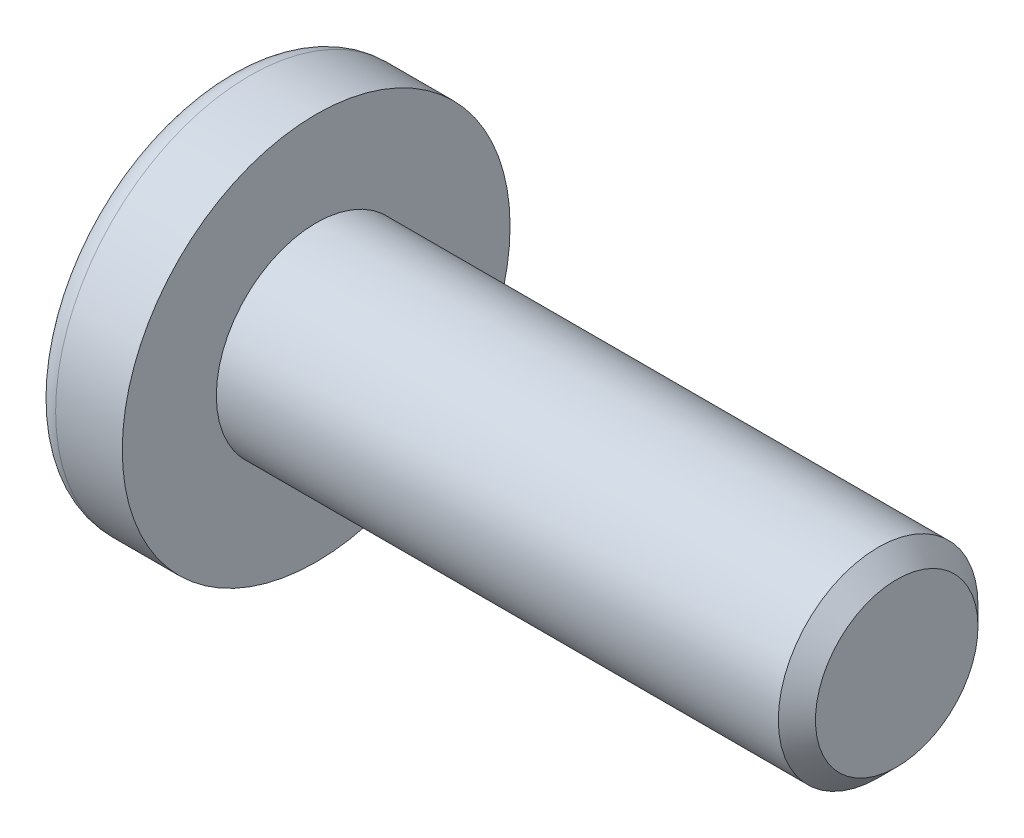
ISO-10303-21;
HEADER;
FILE_DESCRIPTION(('STEP AP214'),'2;1');
FILE_NAME('part.step','',(''),(''),'','','');
FILE_SCHEMA(('AUTOMOTIVE_DESIGN { 1 0 10303 214 1 1 1 1 }'));
ENDSEC;
DATA;
#1=APPLICATION_CONTEXT('core data for automotive mechanical design processes');
#2=APPLICATION_PROTOCOL_DEFINITION('international standard','automotive_design',2000,#1);
#3=PRODUCT_CONTEXT('',#1,'mechanical');
#4=PRODUCT('Part','Part','',(#3));
#5=PRODUCT_RELATED_PRODUCT_CATEGORY('part','',(#4));
#6=PRODUCT_DEFINITION_FORMATION('','',#4);
#7=PRODUCT_DEFINITION_CONTEXT('part definition',#1,'design');
#8=PRODUCT_DEFINITION('design','',#6,#7);
#9=PRODUCT_DEFINITION_SHAPE('','',#8);
#10=(LENGTH_UNIT() NAMED_UNIT(*) SI_UNIT(.MILLI.,.METRE.));
#11=(NAMED_UNIT(*) PLANE_ANGLE_UNIT() SI_UNIT($,.RADIAN.));
#12=(NAMED_UNIT(*) SI_UNIT($,.STERADIAN.) SOLID_ANGLE_UNIT());
#13=UNCERTAINTY_MEASURE_WITH_UNIT(LENGTH_MEASURE(1.E-05),#10,'distance_accuracy_value','');
#14=(GEOMETRIC_REPRESENTATION_CONTEXT(3) GLOBAL_UNCERTAINTY_ASSIGNED_CONTEXT((#13)) GLOBAL_UNIT_ASSIGNED_CONTEXT((#10,
#11,#12)) REPRESENTATION_CONTEXT('',''));
#15=CARTESIAN_POINT('',(0.,0.,0.));
#16=DIRECTION('',(0.,0.,1.));
#17=DIRECTION('',(1.,0.,0.));
#18=AXIS2_PLACEMENT_3D('',#15,#16,#17);
#19=CARTESIAN_POINT('',(3.49504,0.,0.));
#20=DIRECTION('',(-1.,0.,0.));
#21=DIRECTION('',(0.,1.,0.));
#22=AXIS2_PLACEMENT_3D('',#19,#20,#21);
#23=SPHERICAL_SURFACE('',#22,3.49504);
#24=CARTESIAN_POINT('',(0.638066947960321,0.,0.));
#25=DIRECTION('',(-1.,0.,0.));
#26=DIRECTION('',(0.,0.,1.));
#27=AXIS2_PLACEMENT_3D('',#24,#25,#26);
#28=CIRCLE('',#27,2.01320877742947);
#29=CARTESIAN_POINT('',(0.638066947960321,0.,2.01320877742947));
#30=VERTEX_POINT('',#29);
#31=EDGE_CURVE('E137',#30,#30,#28,.T.);
#32=ORIENTED_EDGE('',*,*,#31,.T.);
#33=EDGE_LOOP('',(#32));
#34=FACE_BOUND('',#33,.T.);
#35=CARTESIAN_POINT('',(3.48860800425343,-0.0562204072662827,0.));
#36=DIRECTION('',(-0.113665320353011,-0.99351909641891,0.));
#37=DIRECTION('',(0.99351909641891,-0.113665320353011,0.));
#38=AXIS2_PLACEMENT_3D('',#35,#36,#37);
#39=CIRCLE('',#38,3.49458187725478);
#40=CARTESIAN_POINT('',(0.227775025036725,0.316840992898337,1.19995665346604));
#41=VERTEX_POINT('',#40);
#42=CARTESIAN_POINT('',(0.033060362162214,0.339117670430593,0.339117670430593));
#43=VERTEX_POINT('',#42);
#44=EDGE_CURVE('E133',#41,#43,#39,.T.);
#45=ORIENTED_EDGE('',*,*,#44,.F.);
#46=CARTESIAN_POINT('',(2.78874832810788,0.,-0.872695468934767));
#47=DIRECTION('',(0.629103472698606,0.,0.777321568360582));
#48=DIRECTION('',(0.777321568360582,0.,-0.629103472698606));
#49=AXIS2_PLACEMENT_3D('',#46,#47,#48);
#50=CIRCLE('',#49,3.30981257691679);
#51=CARTESIAN_POINT('',(0.227775025036724,-0.316840992898345,1.19995665346604));
#52=VERTEX_POINT('',#51);
#53=EDGE_CURVE('E125',#41,#52,#50,.T.);
#54=ORIENTED_EDGE('',*,*,#53,.T.);
#55=CARTESIAN_POINT('',(3.48860800425343,0.0562204072662818,0.));
#56=DIRECTION('',(-0.11366532035301,0.99351909641891,0.));
#57=DIRECTION('',(-0.99351909641891,-0.11366532035301,0.));
#58=AXIS2_PLACEMENT_3D('',#55,#56,#57);
#59=CIRCLE('',#58,3.49458187725478);
#60=CARTESIAN_POINT('',(0.0330603621622127,-0.339117670430595,0.339117670430594));
#61=VERTEX_POINT('',#60);
#62=EDGE_CURVE('E376',#61,#52,#59,.T.);
#63=ORIENTED_EDGE('',*,*,#62,.F.);
#64=CARTESIAN_POINT('',(3.48860800425343,0.,-0.0562204072662819));
#65=DIRECTION('',(-0.11366532035301,0.,-0.99351909641891));
#66=DIRECTION('',(-0.99351909641891,0.,0.11366532035301));
#67=AXIS2_PLACEMENT_3D('',#64,#65,#66);
#68=CIRCLE('',#67,3.49458187725478);
#69=CARTESIAN_POINT('',(0.227775025036724,-1.19995665346604,0.316840992898341));
#70=VERTEX_POINT('',#69);
#71=EDGE_CURVE('E171',#70,#61,#68,.T.);
#72=ORIENTED_EDGE('',*,*,#71,.F.);
#73=CARTESIAN_POINT('',(2.78874832810788,0.872695468934764,0.));
#74=DIRECTION('',(0.629103472698606,-0.777321568360582,0.));
#75=DIRECTION('',(0.777321568360582,0.629103472698606,0.));
#76=AXIS2_PLACEMENT_3D('',#73,#74,#75);
#77=CIRCLE('',#76,3.30981257691679);
#78=CARTESIAN_POINT('',(0.227775025036722,-1.19995665346604,-0.316840992898341));
#79=VERTEX_POINT('',#78);
#80=EDGE_CURVE('E167',#70,#79,#77,.T.);
#81=ORIENTED_EDGE('',*,*,#80,.T.);
#82=CARTESIAN_POINT('',(3.48860800425343,0.,0.0562204072662826));
#83=DIRECTION('',(-0.113665320353011,0.,0.99351909641891));
#84=DIRECTION('',(0.99351909641891,0.,0.113665320353011));
#85=AXIS2_PLACEMENT_3D('',#82,#83,#84);
#86=CIRCLE('',#85,3.49458187725478);
#87=CARTESIAN_POINT('',(0.0330603621622127,-0.339117670430592,-0.339117670430594));
#88=VERTEX_POINT('',#87);
#89=EDGE_CURVE('E51',#88,#79,#86,.T.);
#90=ORIENTED_EDGE('',*,*,#89,.F.);
#91=CARTESIAN_POINT('',(0.227775025036724,-0.316840992898336,-1.19995665346604));
#92=VERTEX_POINT('',#91);
#93=EDGE_CURVE('E374',#92,#88,#59,.T.);
#94=ORIENTED_EDGE('',*,*,#93,.F.);
#95=CARTESIAN_POINT('',(2.78874832810788,0.,0.872695468934766));
#96=DIRECTION('',(0.629103472698606,0.,-0.777321568360582));
#97=DIRECTION('',(-0.777321568360582,0.,-0.629103472698606));
#98=AXIS2_PLACEMENT_3D('',#95,#96,#97);
#99=CIRCLE('',#98,3.30981257691679);
#100=CARTESIAN_POINT('',(0.227775025036724,0.316840992898345,-1.19995665346604));
#101=VERTEX_POINT('',#100);
#102=EDGE_CURVE('E381',#92,#101,#99,.T.);
#103=ORIENTED_EDGE('',*,*,#102,.T.);
#104=CARTESIAN_POINT('',(0.033060362162214,0.339117670430595,-0.339117670430594));
#105=VERTEX_POINT('',#104);
#106=EDGE_CURVE('E110',#105,#101,#39,.T.);
#107=ORIENTED_EDGE('',*,*,#106,.F.);
#108=CARTESIAN_POINT('',(0.227775025036726,1.19995665346604,-0.316840992898341));
#109=VERTEX_POINT('',#108);
#110=EDGE_CURVE('E132',#109,#105,#86,.T.);
#111=ORIENTED_EDGE('',*,*,#110,.F.);
#112=CARTESIAN_POINT('',(2.78874832810788,-0.872695468934769,0.));
#113=DIRECTION('',(0.629103472698606,0.777321568360582,0.));
#114=DIRECTION('',(-0.777321568360582,0.629103472698606,0.));
#115=AXIS2_PLACEMENT_3D('',#112,#113,#114);
#116=CIRCLE('',#115,3.30981257691679);
#117=CARTESIAN_POINT('',(0.227775025036726,1.19995665346604,0.31684099289834));
#118=VERTEX_POINT('',#117);
#119=EDGE_CURVE('E59',#109,#118,#116,.T.);
#120=ORIENTED_EDGE('',*,*,#119,.T.);
#121=EDGE_CURVE('E170',#43,#118,#68,.T.);
#122=ORIENTED_EDGE('',*,*,#121,.F.);
#123=EDGE_LOOP('',(#45,#54,#63,#72,#81,#90,#94,#103,#107,#111,#120,#122));
#124=FACE_BOUND('',#123,.T.);
#125=ADVANCED_FACE('F36',(#34,#124),#23,.T.);
#126=CARTESIAN_POINT('',(1.71044397905759,0.,-0.147213612565445));
#127=DIRECTION('',(-0.113665320353011,0.,0.99351909641891));
#128=DIRECTION('',(0.99351909641891,0.,0.113665320353011));
#129=AXIS2_PLACEMENT_3D('',#126,#127,#128);
#130=PLANE('',#129);
#131=ORIENTED_EDGE('',*,*,#110,.T.);
#132=DIRECTION('',(0.987162587649563,-0.112938092654823,0.112938092654823));
#133=VECTOR('',#132,1.);
#134=CARTESIAN_POINT('',(1.72685656853982,0.145335901056886,-0.145335901056885));
#135=LINE('',#134,#133);
#136=CARTESIAN_POINT('',(1.4986,0.171450000000001,-0.17145));
#137=VERTEX_POINT('',#136);
#138=EDGE_CURVE('E108',#105,#137,#135,.T.);
#139=ORIENTED_EDGE('',*,*,#138,.T.);
#140=DIRECTION('',(0.774265880811046,-0.626630437436058,0.0885812660249925));
#141=VECTOR('',#140,1.);
#142=CARTESIAN_POINT('',(0.,1.3843,-0.3429));
#143=LINE('',#142,#141);
#144=EDGE_CURVE('E130',#109,#137,#143,.T.);
#145=ORIENTED_EDGE('',*,*,#144,.F.);
#146=EDGE_LOOP('',(#131,#139,#145));
#147=FACE_BOUND('',#146,.T.);
#148=ADVANCED_FACE('F129',(#147),#130,.T.);
#149=DIRECTION('',(0.774265880811046,0.626630437436058,0.0885812660249925));
#150=VECTOR('',#149,1.);
#151=CARTESIAN_POINT('',(0.,-1.3843,-0.3429));
#152=LINE('',#151,#150);
#153=CARTESIAN_POINT('',(1.4986,-0.17145,-0.17145));
#154=VERTEX_POINT('',#153);
#155=EDGE_CURVE('E152',#79,#154,#152,.T.);
#156=ORIENTED_EDGE('',*,*,#155,.T.);
#157=DIRECTION('',(-0.987162587649563,-0.112938092654822,-0.112938092654823));
#158=VECTOR('',#157,1.);
#159=CARTESIAN_POINT('',(1.72685656853982,-0.145335901056885,-0.145335901056885));
#160=LINE('',#159,#158);
#161=EDGE_CURVE('E365',#154,#88,#160,.T.);
#162=ORIENTED_EDGE('',*,*,#161,.T.);
#163=ORIENTED_EDGE('',*,*,#89,.T.);
#164=EDGE_LOOP('',(#156,#162,#163));
#165=FACE_BOUND('',#164,.T.);
#166=ADVANCED_FACE('F200',(#165),#130,.T.);
#167=CARTESIAN_POINT('',(1.71044397905759,0.,0.147213612565445));
#168=DIRECTION('',(-0.11366532035301,0.,-0.99351909641891));
#169=DIRECTION('',(-0.99351909641891,0.,0.11366532035301));
#170=AXIS2_PLACEMENT_3D('',#167,#168,#169);
#171=PLANE('',#170);
#172=DIRECTION('',(0.774265880811046,-0.626630437436058,-0.0885812660249922));
#173=VECTOR('',#172,1.);
#174=CARTESIAN_POINT('',(0.,1.3843,0.342899999999999));
#175=LINE('',#174,#173);
#176=CARTESIAN_POINT('',(1.4986,0.17145,0.17145));
#177=VERTEX_POINT('',#176);
#178=EDGE_CURVE('E138',#118,#177,#175,.T.);
#179=ORIENTED_EDGE('',*,*,#178,.T.);
#180=DIRECTION('',(-0.987162587649563,0.112938092654822,0.112938092654822));
#181=VECTOR('',#180,1.);
#182=CARTESIAN_POINT('',(1.72685656853981,0.145335901056885,0.145335901056886));
#183=LINE('',#182,#181);
#184=EDGE_CURVE('E371',#177,#43,#183,.T.);
#185=ORIENTED_EDGE('',*,*,#184,.T.);
#186=ORIENTED_EDGE('',*,*,#121,.T.);
#187=EDGE_LOOP('',(#179,#185,#186));
#188=FACE_BOUND('',#187,.T.);
#189=ADVANCED_FACE('F231',(#188),#171,.T.);
#190=ORIENTED_EDGE('',*,*,#71,.T.);
#191=DIRECTION('',(0.987162587649563,0.112938092654823,-0.112938092654822));
#192=VECTOR('',#191,1.);
#193=CARTESIAN_POINT('',(1.72685656853982,-0.145335901056886,0.145335901056886));
#194=LINE('',#193,#192);
#195=CARTESIAN_POINT('',(1.4986,-0.171450000000001,0.171449999999999));
#196=VERTEX_POINT('',#195);
#197=EDGE_CURVE('E378',#61,#196,#194,.T.);
#198=ORIENTED_EDGE('',*,*,#197,.T.);
#199=DIRECTION('',(0.774265880811046,0.626630437436058,-0.0885812660249922));
#200=VECTOR('',#199,1.);
#201=CARTESIAN_POINT('',(0.,-1.3843,0.342899999999999));
#202=LINE('',#201,#200);
#203=EDGE_CURVE('E149',#70,#196,#202,.T.);
#204=ORIENTED_EDGE('',*,*,#203,.F.);
#205=EDGE_LOOP('',(#190,#198,#204));
#206=FACE_BOUND('',#205,.T.);
#207=ADVANCED_FACE('F220',(#206),#171,.T.);
#208=CARTESIAN_POINT('',(-25.4,0.,0.));
#209=DIRECTION('',(-1.,0.,0.));
#210=DIRECTION('',(0.,0.,1.));
#211=AXIS2_PLACEMENT_3D('',#208,#209,#210);
#212=CYLINDRICAL_SURFACE('',#211,1.0922);
#213=CARTESIAN_POINT('',(7.7216,0.,0.));
#214=DIRECTION('',(1.,0.,0.));
#215=DIRECTION('',(0.,0.,-1.));
#216=AXIS2_PLACEMENT_3D('',#213,#214,#215);
#217=CIRCLE('',#216,1.0922);
#218=CARTESIAN_POINT('',(7.7216,0.,-1.0922));
#219=VERTEX_POINT('',#218);
#220=EDGE_CURVE('E44',#219,#219,#217,.F.);
#221=ORIENTED_EDGE('',*,*,#220,.T.);
#222=EDGE_LOOP('',(#221));
#223=FACE_BOUND('',#222,.T.);
#224=CARTESIAN_POINT('',(1.5748,0.,0.));
#225=DIRECTION('',(-1.,0.,0.));
#226=DIRECTION('',(0.,0.,1.));
#227=AXIS2_PLACEMENT_3D('',#224,#225,#226);
#228=CIRCLE('',#227,1.0922);
#229=CARTESIAN_POINT('',(1.5748,0.,1.0922));
#230=VERTEX_POINT('',#229);
#231=EDGE_CURVE('E164',#230,#230,#228,.T.);
#232=ORIENTED_EDGE('',*,*,#231,.F.);
#233=EDGE_LOOP('',(#232));
#234=FACE_BOUND('',#233,.T.);
#235=ADVANCED_FACE('F38',(#223,#234),#212,.T.);
#236=CARTESIAN_POINT('',(1.5748,1.0922,0.));
#237=DIRECTION('',(-1.,0.,0.));
#238=DIRECTION('',(0.,0.,1.));
#239=AXIS2_PLACEMENT_3D('',#236,#237,#238);
#240=PLANE('',#239);
#241=CARTESIAN_POINT('',(1.5748,0.,0.));
#242=DIRECTION('',(-1.,0.,0.));
#243=DIRECTION('',(0.,0.,1.));
#244=AXIS2_PLACEMENT_3D('',#241,#242,#243);
#245=CIRCLE('',#244,2.1209);
#246=CARTESIAN_POINT('',(1.5748,0.,2.1209));
#247=VERTEX_POINT('',#246);
#248=EDGE_CURVE('E161',#247,#247,#245,.T.);
#249=ORIENTED_EDGE('',*,*,#248,.F.);
#250=EDGE_LOOP('',(#249));
#251=FACE_BOUND('',#250,.T.);
#252=ORIENTED_EDGE('',*,*,#231,.T.);
#253=EDGE_LOOP('',(#252));
#254=FACE_BOUND('',#253,.T.);
#255=ADVANCED_FACE('F213',(#251,#254),#240,.F.);
#256=CARTESIAN_POINT('',(-25.4,0.,0.));
#257=DIRECTION('',(-1.,0.,0.));
#258=DIRECTION('',(0.,0.,1.));
#259=AXIS2_PLACEMENT_3D('',#256,#257,#258);
#260=CYLINDRICAL_SURFACE('',#259,2.1209);
#261=ORIENTED_EDGE('',*,*,#248,.T.);
#262=EDGE_LOOP('',(#261));
#263=FACE_BOUND('',#262,.T.);
#264=CARTESIAN_POINT('',(0.845695803486458,0.,0.));
#265=DIRECTION('',(-1.,0.,0.));
#266=DIRECTION('',(0.,0.,1.));
#267=AXIS2_PLACEMENT_3D('',#264,#265,#266);
#268=CIRCLE('',#267,2.1209);
#269=CARTESIAN_POINT('',(0.845695803486458,0.,2.1209));
#270=VERTEX_POINT('',#269);
#271=EDGE_CURVE('E158',#270,#270,#268,.T.);
#272=ORIENTED_EDGE('',*,*,#271,.F.);
#273=EDGE_LOOP('',(#272));
#274=FACE_BOUND('',#273,.T.);
#275=ADVANCED_FACE('F210',(#263,#274),#260,.T.);
#276=CARTESIAN_POINT('',(0.845695803486459,0.,0.));
#277=DIRECTION('',(-1.,0.,0.));
#278=DIRECTION('',(0.,0.,1.));
#279=AXIS2_PLACEMENT_3D('',#276,#277,#278);
#280=TOROIDAL_SURFACE('',#279,1.8669,0.254000000000001);
#281=ORIENTED_EDGE('',*,*,#271,.T.);
#282=EDGE_LOOP('',(#281));
#283=FACE_BOUND('',#282,.T.);
#284=ORIENTED_EDGE('',*,*,#31,.F.);
#285=EDGE_LOOP('',(#284));
#286=FACE_BOUND('',#285,.T.);
#287=ADVANCED_FACE('F207',(#283,#286),#280,.T.);
#288=CARTESIAN_POINT('',(7.9248,1.0922,0.));
#289=DIRECTION('',(1.,0.,0.));
#290=DIRECTION('',(0.,0.,-1.));
#291=AXIS2_PLACEMENT_3D('',#288,#289,#290);
#292=PLANE('',#291);
#293=CARTESIAN_POINT('',(7.9248,0.,0.));
#294=DIRECTION('',(1.,0.,0.));
#295=DIRECTION('',(0.,0.,-1.));
#296=AXIS2_PLACEMENT_3D('',#293,#294,#295);
#297=CIRCLE('',#296,0.888999999999997);
#298=CARTESIAN_POINT('',(7.9248,0.,-0.888999999999997));
#299=VERTEX_POINT('',#298);
#300=EDGE_CURVE('E11',#299,#299,#297,.T.);
#301=ORIENTED_EDGE('',*,*,#300,.T.);
#302=EDGE_LOOP('',(#301));
#303=FACE_BOUND('',#302,.T.);
#304=ADVANCED_FACE('F205',(#303),#292,.T.);
#305=CARTESIAN_POINT('',(1.4986,0.17145,0.17145));
#306=DIRECTION('',(0.629103472698606,0.777321568360582,0.));
#307=DIRECTION('',(-0.777321568360582,0.629103472698606,0.));
#308=AXIS2_PLACEMENT_3D('',#305,#306,#307);
#309=PLANE('',#308);
#310=ORIENTED_EDGE('',*,*,#144,.T.);
#311=DIRECTION('',(0.,0.,-1.));
#312=VECTOR('',#311,1.);
#313=CARTESIAN_POINT('',(1.4986,0.17145,0.17145));
#314=LINE('',#313,#312);
#315=EDGE_CURVE('E124',#177,#137,#314,.T.);
#316=ORIENTED_EDGE('',*,*,#315,.F.);
#317=ORIENTED_EDGE('',*,*,#178,.F.);
#318=ORIENTED_EDGE('',*,*,#119,.F.);
#319=EDGE_LOOP('',(#310,#316,#317,#318));
#320=FACE_BOUND('',#319,.T.);
#321=ADVANCED_FACE('F136',(#320),#309,.F.);
#322=CARTESIAN_POINT('',(0.,-1.3843,-0.3429));
#323=DIRECTION('',(0.629103472698606,-0.777321568360582,0.));
#324=DIRECTION('',(0.777321568360582,0.629103472698606,0.));
#325=AXIS2_PLACEMENT_3D('',#322,#323,#324);
#326=PLANE('',#325);
#327=ORIENTED_EDGE('',*,*,#203,.T.);
#328=DIRECTION('',(0.,0.,1.));
#329=VECTOR('',#328,1.);
#330=CARTESIAN_POINT('',(1.4986,-0.17145,-0.17145));
#331=LINE('',#330,#329);
#332=EDGE_CURVE('E145',#154,#196,#331,.T.);
#333=ORIENTED_EDGE('',*,*,#332,.F.);
#334=ORIENTED_EDGE('',*,*,#155,.F.);
#335=ORIENTED_EDGE('',*,*,#80,.F.);
#336=EDGE_LOOP('',(#327,#333,#334,#335));
#337=FACE_BOUND('',#336,.T.);
#338=ADVANCED_FACE('F239',(#337),#326,.F.);
#339=CARTESIAN_POINT('',(1.4986,0.17145,-0.17145));
#340=DIRECTION('',(-1.,0.,0.));
#341=DIRECTION('',(0.,0.,1.));
#342=AXIS2_PLACEMENT_3D('',#339,#340,#341);
#343=PLANE('',#342);
#344=DIRECTION('',(0.,1.,0.));
#345=VECTOR('',#344,1.);
#346=CARTESIAN_POINT('',(1.4986,-0.17145,-0.17145));
#347=LINE('',#346,#345);
#348=EDGE_CURVE('E117',#154,#137,#347,.T.);
#349=ORIENTED_EDGE('',*,*,#348,.F.);
#350=ORIENTED_EDGE('',*,*,#332,.T.);
#351=DIRECTION('',(0.,-1.,0.));
#352=VECTOR('',#351,1.);
#353=CARTESIAN_POINT('',(1.4986,0.17145,0.17145));
#354=LINE('',#353,#352);
#355=EDGE_CURVE('E143',#177,#196,#354,.T.);
#356=ORIENTED_EDGE('',*,*,#355,.F.);
#357=ORIENTED_EDGE('',*,*,#315,.T.);
#358=EDGE_LOOP('',(#349,#350,#356,#357));
#359=FACE_BOUND('',#358,.T.);
#360=ADVANCED_FACE('F141',(#359),#343,.T.);
#361=CARTESIAN_POINT('',(0.,0.342900000000005,-1.3843));
#362=DIRECTION('',(0.629103472698606,0.,-0.777321568360582));
#363=DIRECTION('',(0.777321568360582,0.,0.629103472698606));
#364=AXIS2_PLACEMENT_3D('',#361,#362,#363);
#365=PLANE('',#364);
#366=DIRECTION('',(0.774265880811046,0.08858126602499,0.626630437436058));
#367=VECTOR('',#366,1.);
#368=CARTESIAN_POINT('',(0.,-0.342899999999994,-1.3843));
#369=LINE('',#368,#367);
#370=EDGE_CURVE('E114',#92,#154,#369,.T.);
#371=ORIENTED_EDGE('',*,*,#370,.T.);
#372=ORIENTED_EDGE('',*,*,#348,.T.);
#373=DIRECTION('',(0.774265880811046,-0.0885812660249947,0.626630437436057));
#374=VECTOR('',#373,1.);
#375=CARTESIAN_POINT('',(0.,0.342900000000005,-1.3843));
#376=LINE('',#375,#374);
#377=EDGE_CURVE('E104',#101,#137,#376,.T.);
#378=ORIENTED_EDGE('',*,*,#377,.F.);
#379=ORIENTED_EDGE('',*,*,#102,.F.);
#380=EDGE_LOOP('',(#371,#372,#378,#379));
#381=FACE_BOUND('',#380,.T.);
#382=ADVANCED_FACE('F118',(#381),#365,.F.);
#383=CARTESIAN_POINT('',(1.71044397905759,-0.147213612565445,0.));
#384=DIRECTION('',(-0.11366532035301,0.99351909641891,0.));
#385=DIRECTION('',(-0.99351909641891,-0.11366532035301,0.));
#386=AXIS2_PLACEMENT_3D('',#383,#384,#385);
#387=PLANE('',#386);
#388=ORIENTED_EDGE('',*,*,#93,.T.);
#389=ORIENTED_EDGE('',*,*,#161,.F.);
#390=ORIENTED_EDGE('',*,*,#370,.F.);
#391=EDGE_LOOP('',(#388,#389,#390));
#392=FACE_BOUND('',#391,.T.);
#393=ADVANCED_FACE('F191',(#392),#387,.T.);
#394=CARTESIAN_POINT('',(1.71044397905759,0.147213612565445,0.));
#395=DIRECTION('',(-0.113665320353011,-0.99351909641891,0.));
#396=DIRECTION('',(0.99351909641891,-0.113665320353011,0.));
#397=AXIS2_PLACEMENT_3D('',#394,#395,#396);
#398=PLANE('',#397);
#399=ORIENTED_EDGE('',*,*,#106,.T.);
#400=ORIENTED_EDGE('',*,*,#377,.T.);
#401=ORIENTED_EDGE('',*,*,#138,.F.);
#402=EDGE_LOOP('',(#399,#400,#401));
#403=FACE_BOUND('',#402,.T.);
#404=ADVANCED_FACE('F106',(#403),#398,.T.);
#405=CARTESIAN_POINT('',(1.4986,-0.171450000000001,0.171449999999999));
#406=DIRECTION('',(0.629103472698606,0.,0.777321568360582));
#407=DIRECTION('',(-0.777321568360582,0.,0.629103472698606));
#408=AXIS2_PLACEMENT_3D('',#405,#406,#407);
#409=PLANE('',#408);
#410=DIRECTION('',(0.774265880811046,-0.0885812660249903,-0.626630437436058));
#411=VECTOR('',#410,1.);
#412=CARTESIAN_POINT('',(0.,0.342899999999995,1.3843));
#413=LINE('',#412,#411);
#414=EDGE_CURVE('E383',#41,#177,#413,.T.);
#415=ORIENTED_EDGE('',*,*,#414,.T.);
#416=ORIENTED_EDGE('',*,*,#355,.T.);
#417=DIRECTION('',(0.774265880811046,0.0885812660249944,-0.626630437436058));
#418=VECTOR('',#417,1.);
#419=CARTESIAN_POINT('',(0.,-0.342900000000004,1.3843));
#420=LINE('',#419,#418);
#421=EDGE_CURVE('E113',#52,#196,#420,.T.);
#422=ORIENTED_EDGE('',*,*,#421,.F.);
#423=ORIENTED_EDGE('',*,*,#53,.F.);
#424=EDGE_LOOP('',(#415,#416,#422,#423));
#425=FACE_BOUND('',#424,.T.);
#426=ADVANCED_FACE('F284',(#425),#409,.F.);
#427=ORIENTED_EDGE('',*,*,#44,.T.);
#428=ORIENTED_EDGE('',*,*,#184,.F.);
#429=ORIENTED_EDGE('',*,*,#414,.F.);
#430=EDGE_LOOP('',(#427,#428,#429));
#431=FACE_BOUND('',#430,.T.);
#432=ADVANCED_FACE('F188',(#431),#398,.T.);
#433=ORIENTED_EDGE('',*,*,#62,.T.);
#434=ORIENTED_EDGE('',*,*,#421,.T.);
#435=ORIENTED_EDGE('',*,*,#197,.F.);
#436=EDGE_LOOP('',(#433,#434,#435));
#437=FACE_BOUND('',#436,.T.);
#438=ADVANCED_FACE('F182',(#437),#387,.T.);
#439=CARTESIAN_POINT('',(7.7216,0.,0.));
#440=DIRECTION('',(-1.,0.,0.));
#441=DIRECTION('',(0.,0.,1.));
#442=AXIS2_PLACEMENT_3D('',#439,#440,#441);
#443=CONICAL_SURFACE('',#442,1.0922,0.785398163397455);
#444=ORIENTED_EDGE('',*,*,#300,.F.);
#445=EDGE_LOOP('',(#444));
#446=FACE_BOUND('',#445,.T.);
#447=ORIENTED_EDGE('',*,*,#220,.F.);
#448=EDGE_LOOP('',(#447));
#449=FACE_BOUND('',#448,.T.);
#450=ADVANCED_FACE('F180',(#446,#449),#443,.T.);
#451=CLOSED_SHELL('',(#125,#148,#166,#189,#207,#235,#255,#275,#287,#304,#321,#338,#360,#382,
#393,#404,#426,#432,#438,#450));
#452=MANIFOLD_SOLID_BREP('B2',#451);
#453=ADVANCED_BREP_SHAPE_REPRESENTATION('',(#18,#452),#14);
#454=SHAPE_DEFINITION_REPRESENTATION(#9,#453);
ENDSEC;
END-ISO-10303-21;
